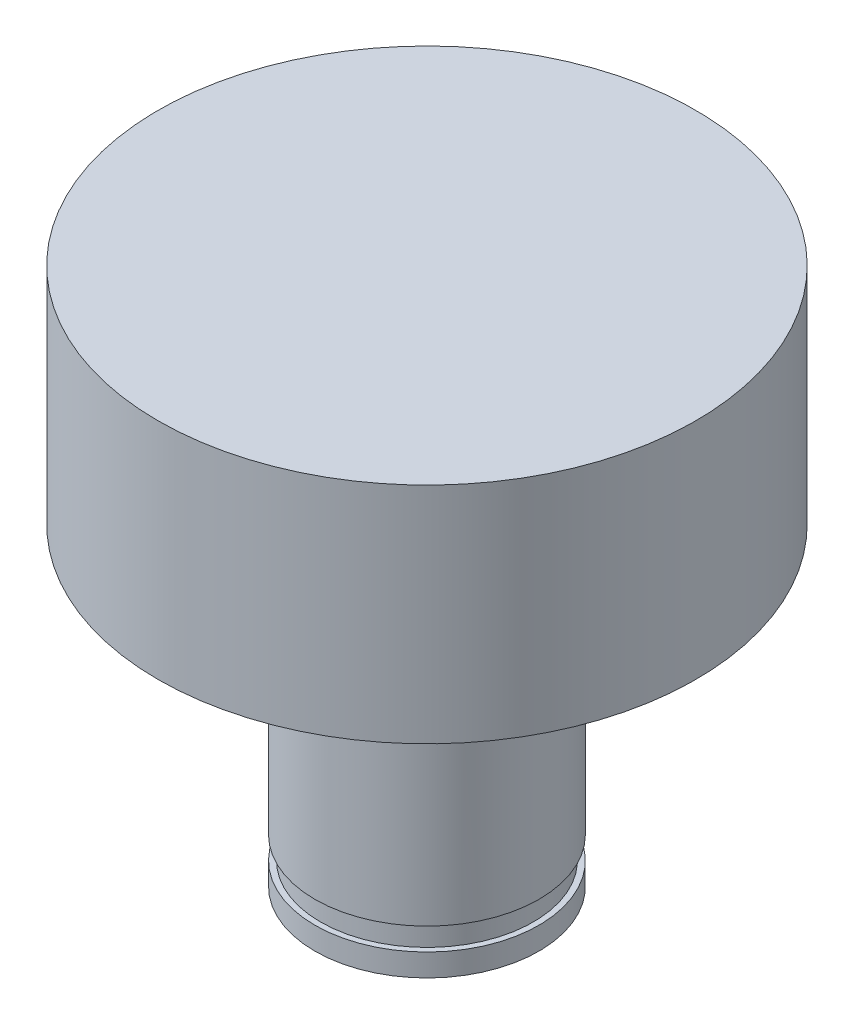
ISO-10303-21;
HEADER;
FILE_DESCRIPTION(('STEP AP214'),'2;1');
FILE_NAME('part.step','',(''),(''),'','','');
FILE_SCHEMA(('AUTOMOTIVE_DESIGN { 1 0 10303 214 1 1 1 1 }'));
ENDSEC;
DATA;
#1=APPLICATION_CONTEXT('core data for automotive mechanical design processes');
#2=APPLICATION_PROTOCOL_DEFINITION('international standard','automotive_design',2000,#1);
#3=PRODUCT_CONTEXT('',#1,'mechanical');
#4=PRODUCT('Part','Part','',(#3));
#5=PRODUCT_RELATED_PRODUCT_CATEGORY('part','',(#4));
#6=PRODUCT_DEFINITION_FORMATION('','',#4);
#7=PRODUCT_DEFINITION_CONTEXT('part definition',#1,'design');
#8=PRODUCT_DEFINITION('design','',#6,#7);
#9=PRODUCT_DEFINITION_SHAPE('','',#8);
#10=(LENGTH_UNIT() NAMED_UNIT(*) SI_UNIT(.MILLI.,.METRE.));
#11=(NAMED_UNIT(*) PLANE_ANGLE_UNIT() SI_UNIT($,.RADIAN.));
#12=(NAMED_UNIT(*) SI_UNIT($,.STERADIAN.) SOLID_ANGLE_UNIT());
#13=UNCERTAINTY_MEASURE_WITH_UNIT(LENGTH_MEASURE(1.E-05),#10,'distance_accuracy_value','');
#14=(GEOMETRIC_REPRESENTATION_CONTEXT(3) GLOBAL_UNCERTAINTY_ASSIGNED_CONTEXT((#13)) GLOBAL_UNIT_ASSIGNED_CONTEXT((#10,
#11,#12)) REPRESENTATION_CONTEXT('',''));
#15=CARTESIAN_POINT('',(0.,0.,0.));
#16=DIRECTION('',(0.,0.,1.));
#17=DIRECTION('',(1.,0.,0.));
#18=AXIS2_PLACEMENT_3D('',#15,#16,#17);
#19=CARTESIAN_POINT('',(0.,-7.,0.));
#20=DIRECTION('',(0.,1.,0.));
#21=DIRECTION('',(0.,0.,1.));
#22=AXIS2_PLACEMENT_3D('',#19,#20,#21);
#23=CYLINDRICAL_SURFACE('',#22,2.5);
#24=CARTESIAN_POINT('',(0.,0.,0.));
#25=DIRECTION('',(0.,1.,0.));
#26=DIRECTION('',(0.,0.,1.));
#27=AXIS2_PLACEMENT_3D('',#24,#25,#26);
#28=CIRCLE('',#27,2.5);
#29=CARTESIAN_POINT('',(0.,0.,2.5));
#30=VERTEX_POINT('',#29);
#31=EDGE_CURVE('E43',#30,#30,#28,.T.);
#32=ORIENTED_EDGE('',*,*,#31,.F.);
#33=EDGE_LOOP('',(#32));
#34=FACE_BOUND('',#33,.T.);
#35=CARTESIAN_POINT('',(0.,-5.99830358410122,0.));
#36=DIRECTION('',(0.,-1.,0.));
#37=DIRECTION('',(0.,0.,-1.));
#38=AXIS2_PLACEMENT_3D('',#35,#36,#37);
#39=CIRCLE('',#38,2.5);
#40=CARTESIAN_POINT('',(0.,-5.99830358410122,-2.5));
#41=VERTEX_POINT('',#40);
#42=EDGE_CURVE('E50',#41,#41,#39,.F.);
#43=ORIENTED_EDGE('',*,*,#42,.T.);
#44=EDGE_LOOP('',(#43));
#45=FACE_BOUND('',#44,.T.);
#46=ADVANCED_FACE('F30',(#34,#45),#23,.T.);
#47=CARTESIAN_POINT('',(0.,5.,0.));
#48=DIRECTION('',(0.,-1.,0.));
#49=DIRECTION('',(0.,0.,-1.));
#50=AXIS2_PLACEMENT_3D('',#47,#48,#49);
#51=CYLINDRICAL_SURFACE('',#50,6.);
#52=CARTESIAN_POINT('',(0.,5.,0.));
#53=DIRECTION('',(0.,1.,0.));
#54=DIRECTION('',(0.,0.,1.));
#55=AXIS2_PLACEMENT_3D('',#52,#53,#54);
#56=CIRCLE('',#55,6.);
#57=CARTESIAN_POINT('',(0.,5.,6.));
#58=VERTEX_POINT('',#57);
#59=EDGE_CURVE('E10',#58,#58,#56,.T.);
#60=ORIENTED_EDGE('',*,*,#59,.F.);
#61=EDGE_LOOP('',(#60));
#62=FACE_BOUND('',#61,.T.);
#63=CARTESIAN_POINT('',(0.,0.,0.));
#64=DIRECTION('',(0.,1.,0.));
#65=DIRECTION('',(0.,0.,1.));
#66=AXIS2_PLACEMENT_3D('',#63,#64,#65);
#67=CIRCLE('',#66,6.);
#68=CARTESIAN_POINT('',(0.,0.,6.));
#69=VERTEX_POINT('',#68);
#70=EDGE_CURVE('E38',#69,#69,#67,.T.);
#71=ORIENTED_EDGE('',*,*,#70,.T.);
#72=EDGE_LOOP('',(#71));
#73=FACE_BOUND('',#72,.T.);
#74=ADVANCED_FACE('F32',(#62,#73),#51,.T.);
#75=CARTESIAN_POINT('',(0.,5.,0.));
#76=DIRECTION('',(0.,1.,0.));
#77=DIRECTION('',(0.,0.,1.));
#78=AXIS2_PLACEMENT_3D('',#75,#76,#77);
#79=PLANE('',#78);
#80=ORIENTED_EDGE('',*,*,#59,.T.);
#81=EDGE_LOOP('',(#80));
#82=FACE_BOUND('',#81,.T.);
#83=ADVANCED_FACE('F77',(#82),#79,.T.);
#84=CARTESIAN_POINT('',(0.,0.,0.));
#85=DIRECTION('',(0.,1.,0.));
#86=DIRECTION('',(0.,0.,1.));
#87=AXIS2_PLACEMENT_3D('',#84,#85,#86);
#88=PLANE('',#87);
#89=ORIENTED_EDGE('',*,*,#31,.T.);
#90=EDGE_LOOP('',(#89));
#91=FACE_BOUND('',#90,.T.);
#92=ORIENTED_EDGE('',*,*,#70,.F.);
#93=EDGE_LOOP('',(#92));
#94=FACE_BOUND('',#93,.T.);
#95=ADVANCED_FACE('F69',(#91,#94),#88,.F.);
#96=CARTESIAN_POINT('',(0.,-57.,0.));
#97=DIRECTION('',(0.,1.,0.));
#98=DIRECTION('',(0.,0.,1.));
#99=AXIS2_PLACEMENT_3D('',#96,#97,#98);
#100=CYLINDRICAL_SURFACE('',#99,2.375);
#101=CARTESIAN_POINT('',(0.,-6.49830358410122,0.));
#102=DIRECTION('',(0.,1.,0.));
#103=DIRECTION('',(0.,0.,1.));
#104=AXIS2_PLACEMENT_3D('',#101,#102,#103);
#105=CIRCLE('',#104,2.375);
#106=CARTESIAN_POINT('',(0.,-6.49830358410122,2.375));
#107=VERTEX_POINT('',#106);
#108=EDGE_CURVE('E52',#107,#107,#105,.T.);
#109=ORIENTED_EDGE('',*,*,#108,.T.);
#110=EDGE_LOOP('',(#109));
#111=FACE_BOUND('',#110,.T.);
#112=CARTESIAN_POINT('',(0.,-5.99830358410122,0.));
#113=DIRECTION('',(0.,1.,0.));
#114=DIRECTION('',(0.,0.,1.));
#115=AXIS2_PLACEMENT_3D('',#112,#113,#114);
#116=CIRCLE('',#115,2.375);
#117=CARTESIAN_POINT('',(0.,-5.99830358410122,2.375));
#118=VERTEX_POINT('',#117);
#119=EDGE_CURVE('E57',#118,#118,#116,.T.);
#120=ORIENTED_EDGE('',*,*,#119,.F.);
#121=EDGE_LOOP('',(#120));
#122=FACE_BOUND('',#121,.T.);
#123=ADVANCED_FACE('F66',(#111,#122),#100,.T.);
#124=CARTESIAN_POINT('',(0.,-6.49830358410122,2.375));
#125=DIRECTION('',(0.,1.,0.));
#126=DIRECTION('',(0.,0.,1.));
#127=AXIS2_PLACEMENT_3D('',#124,#125,#126);
#128=PLANE('',#127);
#129=CARTESIAN_POINT('',(0.,-6.49830358410122,0.));
#130=DIRECTION('',(0.,1.,0.));
#131=DIRECTION('',(0.,0.,1.));
#132=AXIS2_PLACEMENT_3D('',#129,#130,#131);
#133=CIRCLE('',#132,2.5);
#134=CARTESIAN_POINT('',(0.,-6.49830358410122,2.5));
#135=VERTEX_POINT('',#134);
#136=EDGE_CURVE('E34',#135,#135,#133,.F.);
#137=ORIENTED_EDGE('',*,*,#136,.F.);
#138=EDGE_LOOP('',(#137));
#139=FACE_BOUND('',#138,.T.);
#140=ORIENTED_EDGE('',*,*,#108,.F.);
#141=EDGE_LOOP('',(#140));
#142=FACE_BOUND('',#141,.T.);
#143=ADVANCED_FACE('F68',(#139,#142),#128,.T.);
#144=CARTESIAN_POINT('',(0.,-5.99830358410122,3.));
#145=DIRECTION('',(0.,-1.,0.));
#146=DIRECTION('',(0.,0.,-1.));
#147=AXIS2_PLACEMENT_3D('',#144,#145,#146);
#148=PLANE('',#147);
#149=ORIENTED_EDGE('',*,*,#42,.F.);
#150=EDGE_LOOP('',(#149));
#151=FACE_BOUND('',#150,.T.);
#152=ORIENTED_EDGE('',*,*,#119,.T.);
#153=EDGE_LOOP('',(#152));
#154=FACE_BOUND('',#153,.T.);
#155=ADVANCED_FACE('F64',(#151,#154),#148,.T.);
#156=CARTESIAN_POINT('',(0.,-7.,0.));
#157=DIRECTION('',(0.,1.,0.));
#158=DIRECTION('',(0.,0.,1.));
#159=AXIS2_PLACEMENT_3D('',#156,#157,#158);
#160=PLANE('',#159);
#161=CARTESIAN_POINT('',(0.,-7.,0.));
#162=DIRECTION('',(0.,1.,0.));
#163=DIRECTION('',(0.,0.,1.));
#164=AXIS2_PLACEMENT_3D('',#161,#162,#163);
#165=CIRCLE('',#164,2.5);
#166=CARTESIAN_POINT('',(0.,-7.,2.5));
#167=VERTEX_POINT('',#166);
#168=EDGE_CURVE('E46',#167,#167,#165,.T.);
#169=ORIENTED_EDGE('',*,*,#168,.F.);
#170=EDGE_LOOP('',(#169));
#171=FACE_BOUND('',#170,.T.);
#172=ADVANCED_FACE('F91',(#171),#160,.F.);
#173=ORIENTED_EDGE('',*,*,#168,.T.);
#174=EDGE_LOOP('',(#173));
#175=FACE_BOUND('',#174,.T.);
#176=ORIENTED_EDGE('',*,*,#136,.T.);
#177=EDGE_LOOP('',(#176));
#178=FACE_BOUND('',#177,.T.);
#179=ADVANCED_FACE('F83',(#175,#178),#23,.T.);
#180=CLOSED_SHELL('',(#46,#74,#83,#95,#123,#143,#155,#172,#179));
#181=MANIFOLD_SOLID_BREP('B2',#180);
#182=ADVANCED_BREP_SHAPE_REPRESENTATION('',(#18,#181),#14);
#183=SHAPE_DEFINITION_REPRESENTATION(#9,#182);
ENDSEC;
END-ISO-10303-21;
